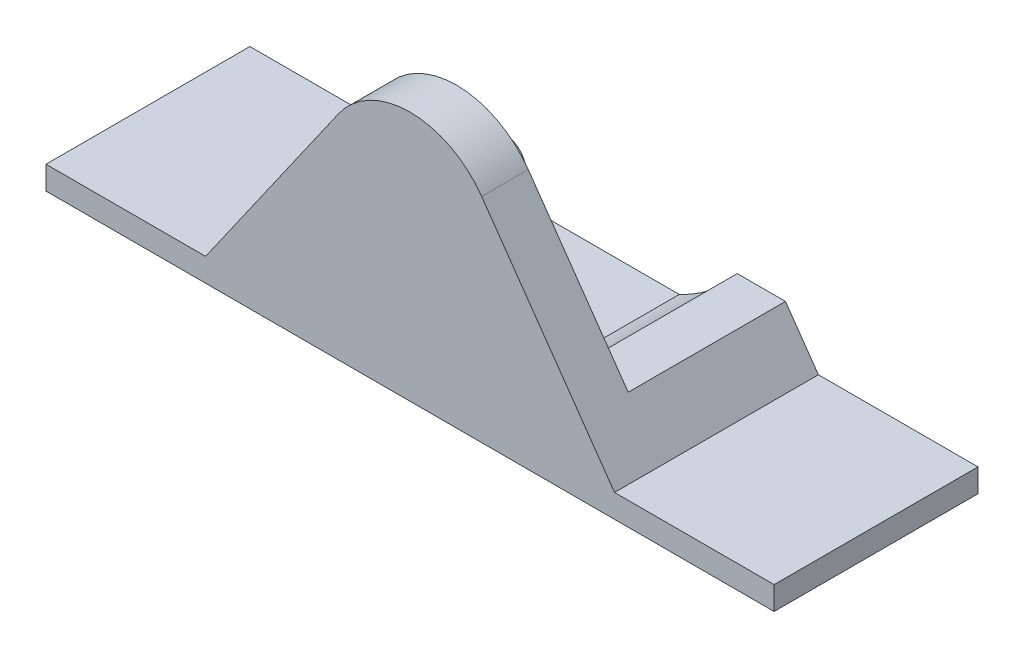
ISO-10303-21;
HEADER;
FILE_DESCRIPTION(('STEP AP214'),'2;1');
FILE_NAME('part.step','',(''),(''),'','','');
FILE_SCHEMA(('AUTOMOTIVE_DESIGN { 1 0 10303 214 1 1 1 1 }'));
ENDSEC;
DATA;
#1=APPLICATION_CONTEXT('core data for automotive mechanical design processes');
#2=APPLICATION_PROTOCOL_DEFINITION('international standard','automotive_design',2000,#1);
#3=PRODUCT_CONTEXT('',#1,'mechanical');
#4=PRODUCT('Part','Part','',(#3));
#5=PRODUCT_RELATED_PRODUCT_CATEGORY('part','',(#4));
#6=PRODUCT_DEFINITION_FORMATION('','',#4);
#7=PRODUCT_DEFINITION_CONTEXT('part definition',#1,'design');
#8=PRODUCT_DEFINITION('design','',#6,#7);
#9=PRODUCT_DEFINITION_SHAPE('','',#8);
#10=(LENGTH_UNIT() NAMED_UNIT(*) SI_UNIT(.MILLI.,.METRE.));
#11=(NAMED_UNIT(*) PLANE_ANGLE_UNIT() SI_UNIT($,.RADIAN.));
#12=(NAMED_UNIT(*) SI_UNIT($,.STERADIAN.) SOLID_ANGLE_UNIT());
#13=UNCERTAINTY_MEASURE_WITH_UNIT(LENGTH_MEASURE(1.E-05),#10,'distance_accuracy_value','');
#14=(GEOMETRIC_REPRESENTATION_CONTEXT(3) GLOBAL_UNCERTAINTY_ASSIGNED_CONTEXT((#13)) GLOBAL_UNIT_ASSIGNED_CONTEXT((#10,
#11,#12)) REPRESENTATION_CONTEXT('',''));
#15=CARTESIAN_POINT('',(0.,0.,0.));
#16=DIRECTION('',(0.,0.,1.));
#17=DIRECTION('',(1.,0.,0.));
#18=AXIS2_PLACEMENT_3D('',#15,#16,#17);
#19=CARTESIAN_POINT('',(0.,4.,0.));
#20=DIRECTION('',(0.,-1.,0.));
#21=DIRECTION('',(0.,0.,-1.));
#22=AXIS2_PLACEMENT_3D('',#19,#20,#21);
#23=PLANE('',#22);
#24=DIRECTION('',(0.,0.,1.));
#25=VECTOR('',#24,1.);
#26=CARTESIAN_POINT('',(51.2777014508074,4.,-60.2080950760808));
#27=LINE('',#26,#25);
#28=CARTESIAN_POINT('',(51.2777014508074,4.,-35.));
#29=VERTEX_POINT('',#28);
#30=CARTESIAN_POINT('',(51.2777014508074,4.,-8.));
#31=VERTEX_POINT('',#30);
#32=EDGE_CURVE('E277',#29,#31,#27,.T.);
#33=ORIENTED_EDGE('',*,*,#32,.T.);
#34=DIRECTION('',(1.,0.,0.));
#35=VECTOR('',#34,1.);
#36=CARTESIAN_POINT('',(27.3981999361581,4.,-8.));
#37=LINE('',#36,#35);
#38=CARTESIAN_POINT('',(73.7222985491926,4.,-8.));
#39=VERTEX_POINT('',#38);
#40=EDGE_CURVE('E163',#31,#39,#37,.T.);
#41=ORIENTED_EDGE('',*,*,#40,.T.);
#42=DIRECTION('',(0.,0.,1.));
#43=VECTOR('',#42,1.);
#44=CARTESIAN_POINT('',(73.7222985491926,4.,-60.2080950760808));
#45=LINE('',#44,#43);
#46=CARTESIAN_POINT('',(73.7222985491926,4.,-35.));
#47=VERTEX_POINT('',#46);
#48=EDGE_CURVE('E49',#47,#39,#45,.T.);
#49=ORIENTED_EDGE('',*,*,#48,.F.);
#50=DIRECTION('',(-1.,0.,0.));
#51=VECTOR('',#50,1.);
#52=CARTESIAN_POINT('',(0.,4.,-35.));
#53=LINE('',#52,#51);
#54=EDGE_CURVE('E203',#47,#29,#53,.T.);
#55=ORIENTED_EDGE('',*,*,#54,.T.);
#56=EDGE_LOOP('',(#33,#41,#49,#55));
#57=FACE_BOUND('',#56,.T.);
#58=ADVANCED_FACE('F33',(#57),#23,.F.);
#59=DIRECTION('',(0.,0.,1.));
#60=VECTOR('',#59,1.);
#61=CARTESIAN_POINT('',(27.3981999361581,4.,-8.));
#62=LINE('',#61,#60);
#63=CARTESIAN_POINT('',(27.3981999361581,4.,-35.));
#64=VERTEX_POINT('',#63);
#65=CARTESIAN_POINT('',(27.3981999361581,4.,0.));
#66=VERTEX_POINT('',#65);
#67=EDGE_CURVE('E186',#64,#66,#62,.T.);
#68=ORIENTED_EDGE('',*,*,#67,.F.);
#69=CARTESIAN_POINT('',(0.,4.,-35.));
#70=VERTEX_POINT('',#69);
#71=EDGE_CURVE('E199',#64,#70,#53,.T.);
#72=ORIENTED_EDGE('',*,*,#71,.T.);
#73=DIRECTION('',(0.,0.,1.));
#74=VECTOR('',#73,1.);
#75=CARTESIAN_POINT('',(0.,4.,0.));
#76=LINE('',#75,#74);
#77=CARTESIAN_POINT('',(0.,4.,0.));
#78=VERTEX_POINT('',#77);
#79=EDGE_CURVE('E189',#70,#78,#76,.T.);
#80=ORIENTED_EDGE('',*,*,#79,.T.);
#81=DIRECTION('',(1.,0.,0.));
#82=VECTOR('',#81,1.);
#83=CARTESIAN_POINT('',(0.,4.,0.));
#84=LINE('',#83,#82);
#85=EDGE_CURVE('E194',#78,#66,#84,.T.);
#86=ORIENTED_EDGE('',*,*,#85,.T.);
#87=EDGE_LOOP('',(#68,#72,#80,#86));
#88=FACE_BOUND('',#87,.T.);
#89=ADVANCED_FACE('F229',(#88),#23,.F.);
#90=CARTESIAN_POINT('',(62.5,28.,-8.));
#91=DIRECTION('',(0.,0.,1.));
#92=DIRECTION('',(1.,0.,0.));
#93=AXIS2_PLACEMENT_3D('',#90,#91,#92);
#94=PLANE('',#93);
#95=CARTESIAN_POINT('',(62.5,28.,-8.));
#96=DIRECTION('',(0.,0.,1.));
#97=DIRECTION('',(1.,0.,0.));
#98=AXIS2_PLACEMENT_3D('',#95,#96,#97);
#99=CIRCLE('',#98,6.);
#100=CARTESIAN_POINT('',(68.5,28.,-8.));
#101=VERTEX_POINT('',#100);
#102=EDGE_CURVE('E37',#101,#101,#99,.F.);
#103=ORIENTED_EDGE('',*,*,#102,.F.);
#104=EDGE_LOOP('',(#103));
#105=FACE_BOUND('',#104,.T.);
#106=CARTESIAN_POINT('',(62.5,28.,-8.));
#107=DIRECTION('',(0.,0.,1.));
#108=DIRECTION('',(-1.,0.,0.));
#109=AXIS2_PLACEMENT_3D('',#106,#107,#108);
#110=CIRCLE('',#109,26.4941500095249);
#111=CARTESIAN_POINT('',(41.3255411454685,12.0757330798256,-8.));
#112=VERTEX_POINT('',#111);
#113=EDGE_CURVE('E158',#112,#31,#110,.T.);
#114=ORIENTED_EDGE('',*,*,#113,.F.);
#115=DIRECTION('',(1.,0.,0.));
#116=VECTOR('',#115,1.);
#117=CARTESIAN_POINT('',(41.3255411454685,12.0757330798256,-8.));
#118=LINE('',#117,#116);
#119=CARTESIAN_POINT('',(33.0492231091981,12.0757330798256,-8.));
#120=VERTEX_POINT('',#119);
#121=EDGE_CURVE('E142',#120,#112,#118,.T.);
#122=ORIENTED_EDGE('',*,*,#121,.F.);
#123=DIRECTION('',(-0.573326836846845,-0.819326759084061,0.));
#124=VECTOR('',#123,1.);
#125=CARTESIAN_POINT('',(50.2100986137391,36.5999025527027,-8.));
#126=LINE('',#125,#124);
#127=CARTESIAN_POINT('',(50.2100986137391,36.5999025527027,-8.));
#128=VERTEX_POINT('',#127);
#129=EDGE_CURVE('E155',#128,#120,#126,.T.);
#130=ORIENTED_EDGE('',*,*,#129,.F.);
#131=CARTESIAN_POINT('',(62.5,28.,-8.));
#132=DIRECTION('',(0.,0.,1.));
#133=DIRECTION('',(1.,0.,0.));
#134=AXIS2_PLACEMENT_3D('',#131,#132,#133);
#135=CIRCLE('',#134,15.);
#136=CARTESIAN_POINT('',(74.7899013862609,36.5999025527027,-8.));
#137=VERTEX_POINT('',#136);
#138=EDGE_CURVE('E164',#137,#128,#135,.T.);
#139=ORIENTED_EDGE('',*,*,#138,.F.);
#140=DIRECTION('',(-0.573326836846844,0.819326759084061,0.));
#141=VECTOR('',#140,1.);
#142=CARTESIAN_POINT('',(74.7899013862609,36.5999025527027,-8.));
#143=LINE('',#142,#141);
#144=CARTESIAN_POINT('',(91.9507768908019,12.0757330798256,-8.));
#145=VERTEX_POINT('',#144);
#146=EDGE_CURVE('E166',#145,#137,#143,.T.);
#147=ORIENTED_EDGE('',*,*,#146,.F.);
#148=DIRECTION('',(1.,0.,0.));
#149=VECTOR('',#148,1.);
#150=CARTESIAN_POINT('',(91.9507768908019,12.0757330798256,-8.));
#151=LINE('',#150,#149);
#152=CARTESIAN_POINT('',(83.6744588545315,12.0757330798256,-8.));
#153=VERTEX_POINT('',#152);
#154=EDGE_CURVE('E299',#153,#145,#151,.T.);
#155=ORIENTED_EDGE('',*,*,#154,.F.);
#156=CARTESIAN_POINT('',(62.5,28.,-8.));
#157=DIRECTION('',(0.,0.,1.));
#158=DIRECTION('',(-1.,0.,0.));
#159=AXIS2_PLACEMENT_3D('',#156,#157,#158);
#160=CIRCLE('',#159,26.4941500095249);
#161=EDGE_CURVE('E297',#39,#153,#160,.T.);
#162=ORIENTED_EDGE('',*,*,#161,.F.);
#163=ORIENTED_EDGE('',*,*,#40,.F.);
#164=EDGE_LOOP('',(#114,#122,#130,#139,#147,#155,#162,#163));
#165=FACE_BOUND('',#164,.T.);
#166=ADVANCED_FACE('F153',(#105,#165),#94,.F.);
#167=CARTESIAN_POINT('',(125.,4.,-35.));
#168=VERTEX_POINT('',#167);
#169=CARTESIAN_POINT('',(97.6018000638419,4.,-35.));
#170=VERTEX_POINT('',#169);
#171=EDGE_CURVE('E200',#168,#170,#53,.T.);
#172=ORIENTED_EDGE('',*,*,#171,.T.);
#173=DIRECTION('',(0.,0.,1.));
#174=VECTOR('',#173,1.);
#175=CARTESIAN_POINT('',(97.6018000638419,4.,-8.));
#176=LINE('',#175,#174);
#177=CARTESIAN_POINT('',(97.6018000638419,4.,0.));
#178=VERTEX_POINT('',#177);
#179=EDGE_CURVE('E57',#170,#178,#176,.T.);
#180=ORIENTED_EDGE('',*,*,#179,.T.);
#181=CARTESIAN_POINT('',(125.,4.,0.));
#182=VERTEX_POINT('',#181);
#183=EDGE_CURVE('E192',#178,#182,#84,.T.);
#184=ORIENTED_EDGE('',*,*,#183,.T.);
#185=DIRECTION('',(0.,0.,-1.));
#186=VECTOR('',#185,1.);
#187=CARTESIAN_POINT('',(125.,4.,0.));
#188=LINE('',#187,#186);
#189=EDGE_CURVE('E197',#182,#168,#188,.T.);
#190=ORIENTED_EDGE('',*,*,#189,.T.);
#191=EDGE_LOOP('',(#172,#180,#184,#190));
#192=FACE_BOUND('',#191,.T.);
#193=ADVANCED_FACE('F228',(#192),#23,.F.);
#194=CARTESIAN_POINT('',(0.,4.,0.));
#195=DIRECTION('',(1.,0.,0.));
#196=DIRECTION('',(0.,0.,-1.));
#197=AXIS2_PLACEMENT_3D('',#194,#195,#196);
#198=PLANE('',#197);
#199=DIRECTION('',(0.,0.,1.));
#200=VECTOR('',#199,1.);
#201=CARTESIAN_POINT('',(0.,0.,0.));
#202=LINE('',#201,#200);
#203=CARTESIAN_POINT('',(0.,0.,-35.));
#204=VERTEX_POINT('',#203);
#205=CARTESIAN_POINT('',(0.,0.,0.));
#206=VERTEX_POINT('',#205);
#207=EDGE_CURVE('E184',#204,#206,#202,.T.);
#208=ORIENTED_EDGE('',*,*,#207,.T.);
#209=DIRECTION('',(0.,-1.,0.));
#210=VECTOR('',#209,1.);
#211=CARTESIAN_POINT('',(0.,4.,0.));
#212=LINE('',#211,#210);
#213=EDGE_CURVE('E218',#78,#206,#212,.T.);
#214=ORIENTED_EDGE('',*,*,#213,.F.);
#215=ORIENTED_EDGE('',*,*,#79,.F.);
#216=DIRECTION('',(0.,-1.,0.));
#217=VECTOR('',#216,1.);
#218=CARTESIAN_POINT('',(0.,4.,-35.));
#219=LINE('',#218,#217);
#220=EDGE_CURVE('E202',#70,#204,#219,.T.);
#221=ORIENTED_EDGE('',*,*,#220,.T.);
#222=EDGE_LOOP('',(#208,#214,#215,#221));
#223=FACE_BOUND('',#222,.T.);
#224=ADVANCED_FACE('F35',(#223),#198,.F.);
#225=CARTESIAN_POINT('',(0.,4.,0.));
#226=DIRECTION('',(0.,0.,-1.));
#227=DIRECTION('',(-1.,0.,0.));
#228=AXIS2_PLACEMENT_3D('',#225,#226,#227);
#229=PLANE('',#228);
#230=DIRECTION('',(1.,0.,0.));
#231=VECTOR('',#230,1.);
#232=CARTESIAN_POINT('',(0.,0.,0.));
#233=LINE('',#232,#231);
#234=CARTESIAN_POINT('',(125.,0.,0.));
#235=VERTEX_POINT('',#234);
#236=EDGE_CURVE('E206',#206,#235,#233,.T.);
#237=ORIENTED_EDGE('',*,*,#236,.T.);
#238=DIRECTION('',(0.,-1.,0.));
#239=VECTOR('',#238,1.);
#240=CARTESIAN_POINT('',(125.,4.,0.));
#241=LINE('',#240,#239);
#242=EDGE_CURVE('E216',#182,#235,#241,.T.);
#243=ORIENTED_EDGE('',*,*,#242,.F.);
#244=ORIENTED_EDGE('',*,*,#183,.F.);
#245=DIRECTION('',(-0.573326836846844,0.819326759084061,0.));
#246=VECTOR('',#245,1.);
#247=CARTESIAN_POINT('',(74.7899013862609,36.5999025527027,0.));
#248=LINE('',#247,#246);
#249=CARTESIAN_POINT('',(74.7899013862609,36.5999025527027,0.));
#250=VERTEX_POINT('',#249);
#251=EDGE_CURVE('E168',#178,#250,#248,.T.);
#252=ORIENTED_EDGE('',*,*,#251,.T.);
#253=CARTESIAN_POINT('',(62.5,28.,0.));
#254=DIRECTION('',(0.,0.,1.));
#255=DIRECTION('',(1.,0.,0.));
#256=AXIS2_PLACEMENT_3D('',#253,#254,#255);
#257=CIRCLE('',#256,15.);
#258=CARTESIAN_POINT('',(50.2100986137391,36.5999025527027,0.));
#259=VERTEX_POINT('',#258);
#260=EDGE_CURVE('E173',#250,#259,#257,.T.);
#261=ORIENTED_EDGE('',*,*,#260,.T.);
#262=DIRECTION('',(-0.573326836846845,-0.819326759084061,0.));
#263=VECTOR('',#262,1.);
#264=CARTESIAN_POINT('',(50.2100986137391,36.5999025527027,0.));
#265=LINE('',#264,#263);
#266=EDGE_CURVE('E176',#259,#66,#265,.T.);
#267=ORIENTED_EDGE('',*,*,#266,.T.);
#268=ORIENTED_EDGE('',*,*,#85,.F.);
#269=ORIENTED_EDGE('',*,*,#213,.T.);
#270=EDGE_LOOP('',(#237,#243,#244,#252,#261,#267,#268,#269));
#271=FACE_BOUND('',#270,.T.);
#272=ADVANCED_FACE('F258',(#271),#229,.F.);
#273=CARTESIAN_POINT('',(125.,4.,0.));
#274=DIRECTION('',(-1.,0.,0.));
#275=DIRECTION('',(0.,0.,1.));
#276=AXIS2_PLACEMENT_3D('',#273,#274,#275);
#277=PLANE('',#276);
#278=DIRECTION('',(0.,0.,-1.));
#279=VECTOR('',#278,1.);
#280=CARTESIAN_POINT('',(125.,0.,0.));
#281=LINE('',#280,#279);
#282=CARTESIAN_POINT('',(125.,0.,-35.));
#283=VERTEX_POINT('',#282);
#284=EDGE_CURVE('E208',#235,#283,#281,.T.);
#285=ORIENTED_EDGE('',*,*,#284,.T.);
#286=DIRECTION('',(0.,-1.,0.));
#287=VECTOR('',#286,1.);
#288=CARTESIAN_POINT('',(125.,4.,-35.));
#289=LINE('',#288,#287);
#290=EDGE_CURVE('E213',#168,#283,#289,.T.);
#291=ORIENTED_EDGE('',*,*,#290,.F.);
#292=ORIENTED_EDGE('',*,*,#189,.F.);
#293=ORIENTED_EDGE('',*,*,#242,.T.);
#294=EDGE_LOOP('',(#285,#291,#292,#293));
#295=FACE_BOUND('',#294,.T.);
#296=ADVANCED_FACE('F255',(#295),#277,.F.);
#297=CARTESIAN_POINT('',(0.,4.,-35.));
#298=DIRECTION('',(0.,0.,1.));
#299=DIRECTION('',(1.,0.,0.));
#300=AXIS2_PLACEMENT_3D('',#297,#298,#299);
#301=PLANE('',#300);
#302=DIRECTION('',(-1.,0.,0.));
#303=VECTOR('',#302,1.);
#304=CARTESIAN_POINT('',(0.,0.,-35.));
#305=LINE('',#304,#303);
#306=EDGE_CURVE('E193',#283,#204,#305,.T.);
#307=ORIENTED_EDGE('',*,*,#306,.T.);
#308=ORIENTED_EDGE('',*,*,#220,.F.);
#309=ORIENTED_EDGE('',*,*,#71,.F.);
#310=DIRECTION('',(-0.573326836846845,-0.819326759084061,0.));
#311=VECTOR('',#310,1.);
#312=CARTESIAN_POINT('',(27.3981999361581,4.,-35.));
#313=LINE('',#312,#311);
#314=CARTESIAN_POINT('',(33.0492231091981,12.0757330798256,-35.));
#315=VERTEX_POINT('',#314);
#316=EDGE_CURVE('E300',#315,#64,#313,.T.);
#317=ORIENTED_EDGE('',*,*,#316,.F.);
#318=DIRECTION('',(-1.,0.,0.));
#319=VECTOR('',#318,1.);
#320=CARTESIAN_POINT('',(41.3255411454685,12.0757330798256,-35.));
#321=LINE('',#320,#319);
#322=CARTESIAN_POINT('',(41.3255411454685,12.0757330798256,-35.));
#323=VERTEX_POINT('',#322);
#324=EDGE_CURVE('E144',#323,#315,#321,.T.);
#325=ORIENTED_EDGE('',*,*,#324,.F.);
#326=CARTESIAN_POINT('',(62.5,28.,-35.));
#327=DIRECTION('',(0.,0.,1.));
#328=DIRECTION('',(1.,0.,0.));
#329=AXIS2_PLACEMENT_3D('',#326,#327,#328);
#330=CIRCLE('',#329,26.4941500095249);
#331=EDGE_CURVE('E148',#29,#323,#330,.F.);
#332=ORIENTED_EDGE('',*,*,#331,.F.);
#333=ORIENTED_EDGE('',*,*,#54,.F.);
#334=CARTESIAN_POINT('',(62.5,28.,-35.));
#335=DIRECTION('',(0.,0.,1.));
#336=DIRECTION('',(1.,0.,0.));
#337=AXIS2_PLACEMENT_3D('',#334,#335,#336);
#338=CIRCLE('',#337,26.4941500095249);
#339=CARTESIAN_POINT('',(83.6744588545315,12.0757330798256,-35.));
#340=VERTEX_POINT('',#339);
#341=EDGE_CURVE('E279',#340,#47,#338,.F.);
#342=ORIENTED_EDGE('',*,*,#341,.F.);
#343=DIRECTION('',(-1.,0.,0.));
#344=VECTOR('',#343,1.);
#345=CARTESIAN_POINT('',(91.9507768908019,12.0757330798256,-35.));
#346=LINE('',#345,#344);
#347=CARTESIAN_POINT('',(91.9507768908019,12.0757330798256,-35.));
#348=VERTEX_POINT('',#347);
#349=EDGE_CURVE('E289',#348,#340,#346,.T.);
#350=ORIENTED_EDGE('',*,*,#349,.F.);
#351=DIRECTION('',(-0.573326836846844,0.819326759084061,0.));
#352=VECTOR('',#351,1.);
#353=CARTESIAN_POINT('',(91.9507768908019,12.0757330798256,-35.));
#354=LINE('',#353,#352);
#355=EDGE_CURVE('E293',#170,#348,#354,.T.);
#356=ORIENTED_EDGE('',*,*,#355,.F.);
#357=ORIENTED_EDGE('',*,*,#171,.F.);
#358=ORIENTED_EDGE('',*,*,#290,.T.);
#359=EDGE_LOOP('',(#307,#308,#309,#317,#325,#332,#333,#342,#350,#356,#357,#358));
#360=FACE_BOUND('',#359,.T.);
#361=ADVANCED_FACE('F251',(#360),#301,.F.);
#362=CARTESIAN_POINT('',(0.,0.,0.));
#363=DIRECTION('',(0.,-1.,0.));
#364=DIRECTION('',(0.,0.,-1.));
#365=AXIS2_PLACEMENT_3D('',#362,#363,#364);
#366=PLANE('',#365);
#367=ORIENTED_EDGE('',*,*,#207,.F.);
#368=ORIENTED_EDGE('',*,*,#306,.F.);
#369=ORIENTED_EDGE('',*,*,#284,.F.);
#370=ORIENTED_EDGE('',*,*,#236,.F.);
#371=EDGE_LOOP('',(#367,#368,#369,#370));
#372=FACE_BOUND('',#371,.T.);
#373=ADVANCED_FACE('F248',(#372),#366,.T.);
#374=CARTESIAN_POINT('',(62.5,28.,-8.));
#375=DIRECTION('',(0.,0.,1.));
#376=DIRECTION('',(1.,0.,0.));
#377=AXIS2_PLACEMENT_3D('',#374,#375,#376);
#378=CYLINDRICAL_SURFACE('',#377,15.);
#379=ORIENTED_EDGE('',*,*,#260,.F.);
#380=DIRECTION('',(0.,0.,1.));
#381=VECTOR('',#380,1.);
#382=CARTESIAN_POINT('',(74.7899013862609,36.5999025527027,-8.));
#383=LINE('',#382,#381);
#384=EDGE_CURVE('E182',#137,#250,#383,.T.);
#385=ORIENTED_EDGE('',*,*,#384,.F.);
#386=ORIENTED_EDGE('',*,*,#138,.T.);
#387=DIRECTION('',(0.,0.,1.));
#388=VECTOR('',#387,1.);
#389=CARTESIAN_POINT('',(50.2100986137391,36.5999025527027,-8.));
#390=LINE('',#389,#388);
#391=EDGE_CURVE('E162',#128,#259,#390,.T.);
#392=ORIENTED_EDGE('',*,*,#391,.T.);
#393=EDGE_LOOP('',(#379,#385,#386,#392));
#394=FACE_BOUND('',#393,.T.);
#395=ADVANCED_FACE('F246',(#394),#378,.T.);
#396=CARTESIAN_POINT('',(74.7899013862609,36.5999025527027,-8.));
#397=DIRECTION('',(0.819326759084062,0.573326836846844,0.));
#398=DIRECTION('',(-0.573326836846844,0.819326759084062,0.));
#399=AXIS2_PLACEMENT_3D('',#396,#397,#398);
#400=PLANE('',#399);
#401=ORIENTED_EDGE('',*,*,#251,.F.);
#402=ORIENTED_EDGE('',*,*,#179,.F.);
#403=ORIENTED_EDGE('',*,*,#355,.T.);
#404=DIRECTION('',(0.,0.,1.));
#405=VECTOR('',#404,1.);
#406=CARTESIAN_POINT('',(91.9507768908019,12.0757330798256,-60.2080950760808));
#407=LINE('',#406,#405);
#408=EDGE_CURVE('E304',#348,#145,#407,.T.);
#409=ORIENTED_EDGE('',*,*,#408,.T.);
#410=ORIENTED_EDGE('',*,*,#146,.T.);
#411=ORIENTED_EDGE('',*,*,#384,.T.);
#412=EDGE_LOOP('',(#401,#402,#403,#409,#410,#411));
#413=FACE_BOUND('',#412,.T.);
#414=ADVANCED_FACE('F320',(#413),#400,.T.);
#415=CARTESIAN_POINT('',(50.2100986137391,36.5999025527027,-8.));
#416=DIRECTION('',(-0.819326759084061,0.573326836846845,0.));
#417=DIRECTION('',(-0.573326836846845,-0.819326759084061,0.));
#418=AXIS2_PLACEMENT_3D('',#415,#416,#417);
#419=PLANE('',#418);
#420=ORIENTED_EDGE('',*,*,#266,.F.);
#421=ORIENTED_EDGE('',*,*,#391,.F.);
#422=ORIENTED_EDGE('',*,*,#129,.T.);
#423=DIRECTION('',(0.,0.,1.));
#424=VECTOR('',#423,1.);
#425=CARTESIAN_POINT('',(33.0492231091981,12.0757330798256,-60.2080950760808));
#426=LINE('',#425,#424);
#427=EDGE_CURVE('E138',#315,#120,#426,.T.);
#428=ORIENTED_EDGE('',*,*,#427,.F.);
#429=ORIENTED_EDGE('',*,*,#316,.T.);
#430=ORIENTED_EDGE('',*,*,#67,.T.);
#431=EDGE_LOOP('',(#420,#421,#422,#428,#429,#430));
#432=FACE_BOUND('',#431,.T.);
#433=ADVANCED_FACE('F161',(#432),#419,.T.);
#434=CARTESIAN_POINT('',(62.5,28.,-9.));
#435=DIRECTION('',(0.,0.,1.));
#436=DIRECTION('',(1.,0.,0.));
#437=AXIS2_PLACEMENT_3D('',#434,#435,#436);
#438=CYLINDRICAL_SURFACE('',#437,6.);
#439=CARTESIAN_POINT('',(62.5,28.,-9.));
#440=DIRECTION('',(0.,0.,-1.));
#441=DIRECTION('',(-1.,0.,0.));
#442=AXIS2_PLACEMENT_3D('',#439,#440,#441);
#443=CIRCLE('',#442,6.);
#444=CARTESIAN_POINT('',(56.5,28.,-9.));
#445=VERTEX_POINT('',#444);
#446=EDGE_CURVE('E177',#445,#445,#443,.T.);
#447=ORIENTED_EDGE('',*,*,#446,.F.);
#448=EDGE_LOOP('',(#447));
#449=FACE_BOUND('',#448,.T.);
#450=ORIENTED_EDGE('',*,*,#102,.T.);
#451=EDGE_LOOP('',(#450));
#452=FACE_BOUND('',#451,.T.);
#453=ADVANCED_FACE('F225',(#449,#452),#438,.T.);
#454=CARTESIAN_POINT('',(62.5,28.,-9.));
#455=DIRECTION('',(0.,0.,-1.));
#456=DIRECTION('',(-1.,0.,0.));
#457=AXIS2_PLACEMENT_3D('',#454,#455,#456);
#458=PLANE('',#457);
#459=CARTESIAN_POINT('',(62.5,28.,-9.));
#460=DIRECTION('',(0.,0.,-1.));
#461=DIRECTION('',(-1.,0.,0.));
#462=AXIS2_PLACEMENT_3D('',#459,#460,#461);
#463=CIRCLE('',#462,3.95);
#464=CARTESIAN_POINT('',(58.55,28.,-9.));
#465=VERTEX_POINT('',#464);
#466=EDGE_CURVE('E11',#465,#465,#463,.T.);
#467=ORIENTED_EDGE('',*,*,#466,.F.);
#468=EDGE_LOOP('',(#467));
#469=FACE_BOUND('',#468,.T.);
#470=ORIENTED_EDGE('',*,*,#446,.T.);
#471=EDGE_LOOP('',(#470));
#472=FACE_BOUND('',#471,.T.);
#473=ADVANCED_FACE('F310',(#469,#472),#458,.T.);
#474=CARTESIAN_POINT('',(62.5,28.,-16.));
#475=DIRECTION('',(0.,0.,1.));
#476=DIRECTION('',(1.,0.,0.));
#477=AXIS2_PLACEMENT_3D('',#474,#475,#476);
#478=CYLINDRICAL_SURFACE('',#477,3.95);
#479=CARTESIAN_POINT('',(62.5,28.,-16.));
#480=DIRECTION('',(0.,0.,-1.));
#481=DIRECTION('',(-1.,0.,0.));
#482=AXIS2_PLACEMENT_3D('',#479,#480,#481);
#483=CIRCLE('',#482,3.95);
#484=CARTESIAN_POINT('',(58.55,28.,-16.));
#485=VERTEX_POINT('',#484);
#486=EDGE_CURVE('E288',#485,#485,#483,.T.);
#487=ORIENTED_EDGE('',*,*,#486,.F.);
#488=EDGE_LOOP('',(#487));
#489=FACE_BOUND('',#488,.T.);
#490=ORIENTED_EDGE('',*,*,#466,.T.);
#491=EDGE_LOOP('',(#490));
#492=FACE_BOUND('',#491,.T.);
#493=ADVANCED_FACE('F317',(#489,#492),#478,.T.);
#494=CARTESIAN_POINT('',(62.5,28.,-16.));
#495=DIRECTION('',(0.,0.,-1.));
#496=DIRECTION('',(-1.,0.,0.));
#497=AXIS2_PLACEMENT_3D('',#494,#495,#496);
#498=PLANE('',#497);
#499=ORIENTED_EDGE('',*,*,#486,.T.);
#500=EDGE_LOOP('',(#499));
#501=FACE_BOUND('',#500,.T.);
#502=ADVANCED_FACE('F324',(#501),#498,.T.);
#503=CARTESIAN_POINT('',(91.9507768908019,12.0757330798256,-60.2080950760808));
#504=DIRECTION('',(0.,-1.,0.));
#505=DIRECTION('',(0.,0.,-1.));
#506=AXIS2_PLACEMENT_3D('',#503,#504,#505);
#507=PLANE('',#506);
#508=ORIENTED_EDGE('',*,*,#408,.F.);
#509=ORIENTED_EDGE('',*,*,#349,.T.);
#510=DIRECTION('',(0.,0.,1.));
#511=VECTOR('',#510,1.);
#512=CARTESIAN_POINT('',(83.6744588545315,12.0757330798256,-60.2080950760808));
#513=LINE('',#512,#511);
#514=EDGE_CURVE('E286',#340,#153,#513,.T.);
#515=ORIENTED_EDGE('',*,*,#514,.T.);
#516=ORIENTED_EDGE('',*,*,#154,.T.);
#517=EDGE_LOOP('',(#508,#509,#515,#516));
#518=FACE_BOUND('',#517,.T.);
#519=ADVANCED_FACE('F328',(#518),#507,.F.);
#520=CARTESIAN_POINT('',(62.5,28.,-60.2080950760808));
#521=DIRECTION('',(0.,0.,1.));
#522=DIRECTION('',(1.,0.,0.));
#523=AXIS2_PLACEMENT_3D('',#520,#521,#522);
#524=CYLINDRICAL_SURFACE('',#523,26.4941500095249);
#525=ORIENTED_EDGE('',*,*,#514,.F.);
#526=ORIENTED_EDGE('',*,*,#341,.T.);
#527=ORIENTED_EDGE('',*,*,#48,.T.);
#528=ORIENTED_EDGE('',*,*,#161,.T.);
#529=EDGE_LOOP('',(#525,#526,#527,#528));
#530=FACE_BOUND('',#529,.T.);
#531=ADVANCED_FACE('F283',(#530),#524,.F.);
#532=CARTESIAN_POINT('',(62.5,28.,-60.2080950760808));
#533=DIRECTION('',(0.,0.,1.));
#534=DIRECTION('',(1.,0.,0.));
#535=AXIS2_PLACEMENT_3D('',#532,#533,#534);
#536=CYLINDRICAL_SURFACE('',#535,26.4941500095249);
#537=ORIENTED_EDGE('',*,*,#32,.F.);
#538=ORIENTED_EDGE('',*,*,#331,.T.);
#539=DIRECTION('',(0.,0.,1.));
#540=VECTOR('',#539,1.);
#541=CARTESIAN_POINT('',(41.3255411454685,12.0757330798256,-60.2080950760808));
#542=LINE('',#541,#540);
#543=EDGE_CURVE('E149',#323,#112,#542,.T.);
#544=ORIENTED_EDGE('',*,*,#543,.T.);
#545=ORIENTED_EDGE('',*,*,#113,.T.);
#546=EDGE_LOOP('',(#537,#538,#544,#545));
#547=FACE_BOUND('',#546,.T.);
#548=ADVANCED_FACE('F332',(#547),#536,.F.);
#549=CARTESIAN_POINT('',(41.3255411454685,12.0757330798256,-60.2080950760808));
#550=DIRECTION('',(0.,-1.,0.));
#551=DIRECTION('',(0.,0.,-1.));
#552=AXIS2_PLACEMENT_3D('',#549,#550,#551);
#553=PLANE('',#552);
#554=ORIENTED_EDGE('',*,*,#543,.F.);
#555=ORIENTED_EDGE('',*,*,#324,.T.);
#556=ORIENTED_EDGE('',*,*,#427,.T.);
#557=ORIENTED_EDGE('',*,*,#121,.T.);
#558=EDGE_LOOP('',(#554,#555,#556,#557));
#559=FACE_BOUND('',#558,.T.);
#560=ADVANCED_FACE('F141',(#559),#553,.F.);
#561=CLOSED_SHELL('',(#58,#89,#166,#193,#224,#272,#296,#361,#373,#395,#414,#433,#453,#473,#493,
#502,#519,#531,#548,#560));
#562=MANIFOLD_SOLID_BREP('B2',#561);
#563=ADVANCED_BREP_SHAPE_REPRESENTATION('',(#18,#562),#14);
#564=SHAPE_DEFINITION_REPRESENTATION(#9,#563);
ENDSEC;
END-ISO-10303-21;
